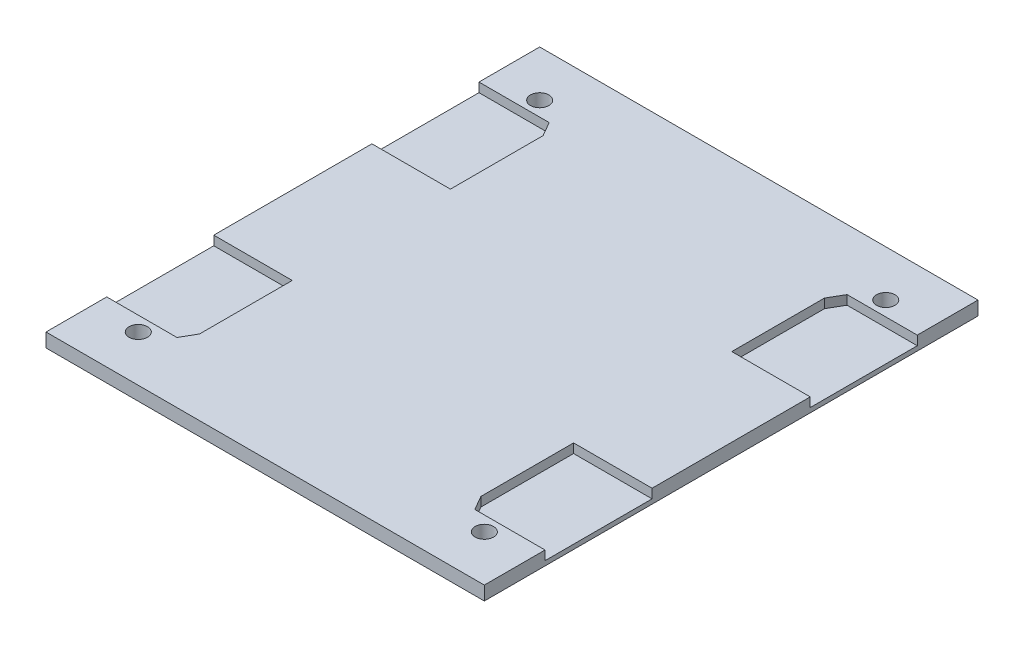
ISO-10303-21;
HEADER;
FILE_DESCRIPTION(('STEP AP214'),'2;1');
FILE_NAME('part.step','',(''),(''),'','','');
FILE_SCHEMA(('AUTOMOTIVE_DESIGN { 1 0 10303 214 1 1 1 1 }'));
ENDSEC;
DATA;
#1=APPLICATION_CONTEXT('core data for automotive mechanical design processes');
#2=APPLICATION_PROTOCOL_DEFINITION('international standard','automotive_design',2000,#1);
#3=PRODUCT_CONTEXT('',#1,'mechanical');
#4=PRODUCT('Part','Part','',(#3));
#5=PRODUCT_RELATED_PRODUCT_CATEGORY('part','',(#4));
#6=PRODUCT_DEFINITION_FORMATION('','',#4);
#7=PRODUCT_DEFINITION_CONTEXT('part definition',#1,'design');
#8=PRODUCT_DEFINITION('design','',#6,#7);
#9=PRODUCT_DEFINITION_SHAPE('','',#8);
#10=(LENGTH_UNIT() NAMED_UNIT(*) SI_UNIT(.MILLI.,.METRE.));
#11=(NAMED_UNIT(*) PLANE_ANGLE_UNIT() SI_UNIT($,.RADIAN.));
#12=(NAMED_UNIT(*) SI_UNIT($,.STERADIAN.) SOLID_ANGLE_UNIT());
#13=UNCERTAINTY_MEASURE_WITH_UNIT(LENGTH_MEASURE(1.E-05),#10,'distance_accuracy_value','');
#14=(GEOMETRIC_REPRESENTATION_CONTEXT(3) GLOBAL_UNCERTAINTY_ASSIGNED_CONTEXT((#13)) GLOBAL_UNIT_ASSIGNED_CONTEXT((#10,
#11,#12)) REPRESENTATION_CONTEXT('',''));
#15=CARTESIAN_POINT('',(0.,0.,0.));
#16=DIRECTION('',(0.,0.,1.));
#17=DIRECTION('',(1.,0.,0.));
#18=AXIS2_PLACEMENT_3D('',#15,#16,#17);
#19=CARTESIAN_POINT('',(47.5,3.,0.));
#20=DIRECTION('',(-1.,0.,0.));
#21=DIRECTION('',(0.,0.,1.));
#22=AXIS2_PLACEMENT_3D('',#19,#20,#21);
#23=PLANE('',#22);
#24=DIRECTION('',(0.,1.,0.));
#25=VECTOR('',#24,1.);
#26=CARTESIAN_POINT('',(47.5,1.,40.337063088162));
#27=LINE('',#26,#25);
#28=CARTESIAN_POINT('',(47.5,1.,40.337063088162));
#29=VERTEX_POINT('',#28);
#30=CARTESIAN_POINT('',(47.5,3.,40.337063088162));
#31=VERTEX_POINT('',#30);
#32=EDGE_CURVE('E248',#29,#31,#27,.T.);
#33=ORIENTED_EDGE('',*,*,#32,.T.);
#34=DIRECTION('',(0.,0.,-1.));
#35=VECTOR('',#34,1.);
#36=CARTESIAN_POINT('',(47.5,3.,0.));
#37=LINE('',#36,#35);
#38=CARTESIAN_POINT('',(47.5,3.,53.5));
#39=VERTEX_POINT('',#38);
#40=EDGE_CURVE('E347',#39,#31,#37,.T.);
#41=ORIENTED_EDGE('',*,*,#40,.F.);
#42=DIRECTION('',(0.,-1.,0.));
#43=VECTOR('',#42,1.);
#44=CARTESIAN_POINT('',(47.5,3.,53.5));
#45=LINE('',#44,#43);
#46=CARTESIAN_POINT('',(47.5,0.,53.5));
#47=VERTEX_POINT('',#46);
#48=EDGE_CURVE('E11',#39,#47,#45,.T.);
#49=ORIENTED_EDGE('',*,*,#48,.T.);
#50=DIRECTION('',(0.,0.,-1.));
#51=VECTOR('',#50,1.);
#52=CARTESIAN_POINT('',(47.5,0.,0.));
#53=LINE('',#52,#51);
#54=CARTESIAN_POINT('',(47.5,0.,-53.5));
#55=VERTEX_POINT('',#54);
#56=EDGE_CURVE('E374',#47,#55,#53,.T.);
#57=ORIENTED_EDGE('',*,*,#56,.T.);
#58=DIRECTION('',(0.,-1.,0.));
#59=VECTOR('',#58,1.);
#60=CARTESIAN_POINT('',(47.5,3.,-53.5));
#61=LINE('',#60,#59);
#62=CARTESIAN_POINT('',(47.5,3.,-53.5));
#63=VERTEX_POINT('',#62);
#64=EDGE_CURVE('E45',#63,#55,#61,.T.);
#65=ORIENTED_EDGE('',*,*,#64,.F.);
#66=CARTESIAN_POINT('',(47.5,3.,-40.337063088162));
#67=VERTEX_POINT('',#66);
#68=EDGE_CURVE('E225',#67,#63,#37,.T.);
#69=ORIENTED_EDGE('',*,*,#68,.F.);
#70=DIRECTION('',(0.,1.,0.));
#71=VECTOR('',#70,1.);
#72=CARTESIAN_POINT('',(47.5,1.,-40.337063088162));
#73=LINE('',#72,#71);
#74=CARTESIAN_POINT('',(47.5,1.,-40.337063088162));
#75=VERTEX_POINT('',#74);
#76=EDGE_CURVE('E204',#75,#67,#73,.T.);
#77=ORIENTED_EDGE('',*,*,#76,.F.);
#78=DIRECTION('',(0.,0.,-1.));
#79=VECTOR('',#78,1.);
#80=CARTESIAN_POINT('',(47.5,1.,0.));
#81=LINE('',#80,#79);
#82=CARTESIAN_POINT('',(47.5,1.,-17.1401594634259));
#83=VERTEX_POINT('',#82);
#84=EDGE_CURVE('E211',#83,#75,#81,.T.);
#85=ORIENTED_EDGE('',*,*,#84,.F.);
#86=DIRECTION('',(0.,1.,0.));
#87=VECTOR('',#86,1.);
#88=CARTESIAN_POINT('',(47.5,1.,-17.1401594634259));
#89=LINE('',#88,#87);
#90=CARTESIAN_POINT('',(47.5,3.,-17.1401594634259));
#91=VERTEX_POINT('',#90);
#92=EDGE_CURVE('E324',#83,#91,#89,.T.);
#93=ORIENTED_EDGE('',*,*,#92,.T.);
#94=CARTESIAN_POINT('',(47.5,3.,17.1401594634259));
#95=VERTEX_POINT('',#94);
#96=EDGE_CURVE('E351',#95,#91,#37,.T.);
#97=ORIENTED_EDGE('',*,*,#96,.F.);
#98=DIRECTION('',(0.,1.,0.));
#99=VECTOR('',#98,1.);
#100=CARTESIAN_POINT('',(47.5,1.,17.1401594634259));
#101=LINE('',#100,#99);
#102=CARTESIAN_POINT('',(47.5,1.,17.1401594634259));
#103=VERTEX_POINT('',#102);
#104=EDGE_CURVE('E269',#103,#95,#101,.T.);
#105=ORIENTED_EDGE('',*,*,#104,.F.);
#106=DIRECTION('',(0.,0.,-1.));
#107=VECTOR('',#106,1.);
#108=CARTESIAN_POINT('',(47.5,1.,0.));
#109=LINE('',#108,#107);
#110=EDGE_CURVE('E236',#29,#103,#109,.T.);
#111=ORIENTED_EDGE('',*,*,#110,.F.);
#112=EDGE_LOOP('',(#33,#41,#49,#57,#65,#69,#77,#85,#93,#97,#105,#111));
#113=FACE_BOUND('',#112,.T.);
#114=ADVANCED_FACE('F37',(#113),#23,.F.);
#115=CARTESIAN_POINT('',(-47.5,3.,0.));
#116=DIRECTION('',(-1.,0.,0.));
#117=DIRECTION('',(0.,0.,1.));
#118=AXIS2_PLACEMENT_3D('',#115,#116,#117);
#119=PLANE('',#118);
#120=DIRECTION('',(0.,0.,1.));
#121=VECTOR('',#120,1.);
#122=CARTESIAN_POINT('',(-47.5,1.,0.));
#123=LINE('',#122,#121);
#124=CARTESIAN_POINT('',(-47.5,1.,17.1401594634259));
#125=VERTEX_POINT('',#124);
#126=CARTESIAN_POINT('',(-47.5,1.,40.337063088162));
#127=VERTEX_POINT('',#126);
#128=EDGE_CURVE('E275',#125,#127,#123,.T.);
#129=ORIENTED_EDGE('',*,*,#128,.F.);
#130=DIRECTION('',(0.,1.,0.));
#131=VECTOR('',#130,1.);
#132=CARTESIAN_POINT('',(-47.5,1.,17.1401594634259));
#133=LINE('',#132,#131);
#134=CARTESIAN_POINT('',(-47.5,3.,17.1401594634259));
#135=VERTEX_POINT('',#134);
#136=EDGE_CURVE('E287',#125,#135,#133,.T.);
#137=ORIENTED_EDGE('',*,*,#136,.T.);
#138=DIRECTION('',(0.,0.,-1.));
#139=VECTOR('',#138,1.);
#140=CARTESIAN_POINT('',(-47.5,3.,0.));
#141=LINE('',#140,#139);
#142=CARTESIAN_POINT('',(-47.5,3.,-17.1401594634259));
#143=VERTEX_POINT('',#142);
#144=EDGE_CURVE('E359',#135,#143,#141,.T.);
#145=ORIENTED_EDGE('',*,*,#144,.T.);
#146=DIRECTION('',(0.,1.,0.));
#147=VECTOR('',#146,1.);
#148=CARTESIAN_POINT('',(-47.5,1.,-17.1401594634259));
#149=LINE('',#148,#147);
#150=CARTESIAN_POINT('',(-47.5,1.,-17.1401594634259));
#151=VERTEX_POINT('',#150);
#152=EDGE_CURVE('E52',#151,#143,#149,.T.);
#153=ORIENTED_EDGE('',*,*,#152,.F.);
#154=DIRECTION('',(0.,0.,1.));
#155=VECTOR('',#154,1.);
#156=CARTESIAN_POINT('',(-47.5,1.,0.));
#157=LINE('',#156,#155);
#158=CARTESIAN_POINT('',(-47.5,1.,-40.337063088162));
#159=VERTEX_POINT('',#158);
#160=EDGE_CURVE('E307',#159,#151,#157,.T.);
#161=ORIENTED_EDGE('',*,*,#160,.F.);
#162=DIRECTION('',(0.,1.,0.));
#163=VECTOR('',#162,1.);
#164=CARTESIAN_POINT('',(-47.5,1.,-40.337063088162));
#165=LINE('',#164,#163);
#166=CARTESIAN_POINT('',(-47.5,3.,-40.337063088162));
#167=VERTEX_POINT('',#166);
#168=EDGE_CURVE('E332',#159,#167,#165,.T.);
#169=ORIENTED_EDGE('',*,*,#168,.T.);
#170=CARTESIAN_POINT('',(-47.5,3.,-53.5));
#171=VERTEX_POINT('',#170);
#172=EDGE_CURVE('E354',#167,#171,#141,.T.);
#173=ORIENTED_EDGE('',*,*,#172,.T.);
#174=DIRECTION('',(0.,-1.,0.));
#175=VECTOR('',#174,1.);
#176=CARTESIAN_POINT('',(-47.5,3.,-53.5));
#177=LINE('',#176,#175);
#178=CARTESIAN_POINT('',(-47.5,0.,-53.5));
#179=VERTEX_POINT('',#178);
#180=EDGE_CURVE('E395',#171,#179,#177,.T.);
#181=ORIENTED_EDGE('',*,*,#180,.T.);
#182=DIRECTION('',(0.,0.,-1.));
#183=VECTOR('',#182,1.);
#184=CARTESIAN_POINT('',(-47.5,0.,0.));
#185=LINE('',#184,#183);
#186=CARTESIAN_POINT('',(-47.5,0.,53.5));
#187=VERTEX_POINT('',#186);
#188=EDGE_CURVE('E380',#187,#179,#185,.T.);
#189=ORIENTED_EDGE('',*,*,#188,.F.);
#190=DIRECTION('',(0.,-1.,0.));
#191=VECTOR('',#190,1.);
#192=CARTESIAN_POINT('',(-47.5,3.,53.5));
#193=LINE('',#192,#191);
#194=CARTESIAN_POINT('',(-47.5,3.,53.5));
#195=VERTEX_POINT('',#194);
#196=EDGE_CURVE('E371',#195,#187,#193,.T.);
#197=ORIENTED_EDGE('',*,*,#196,.F.);
#198=CARTESIAN_POINT('',(-47.5,3.,40.337063088162));
#199=VERTEX_POINT('',#198);
#200=EDGE_CURVE('E355',#195,#199,#141,.T.);
#201=ORIENTED_EDGE('',*,*,#200,.T.);
#202=DIRECTION('',(0.,1.,0.));
#203=VECTOR('',#202,1.);
#204=CARTESIAN_POINT('',(-47.5,1.,40.337063088162));
#205=LINE('',#204,#203);
#206=EDGE_CURVE('E60',#127,#199,#205,.T.);
#207=ORIENTED_EDGE('',*,*,#206,.F.);
#208=EDGE_LOOP('',(#129,#137,#145,#153,#161,#169,#173,#181,#189,#197,#201,#207));
#209=FACE_BOUND('',#208,.T.);
#210=ADVANCED_FACE('F409',(#209),#119,.T.);
#211=CARTESIAN_POINT('',(0.,3.,0.));
#212=DIRECTION('',(0.,1.,0.));
#213=DIRECTION('',(0.,0.,1.));
#214=AXIS2_PLACEMENT_3D('',#211,#212,#213);
#215=PLANE('',#214);
#216=CARTESIAN_POINT('',(-37.5,3.,-43.5));
#217=DIRECTION('',(0.,1.,0.));
#218=DIRECTION('',(0.,0.,1.));
#219=AXIS2_PLACEMENT_3D('',#216,#217,#218);
#220=CIRCLE('',#219,2.);
#221=CARTESIAN_POINT('',(-37.5,3.,-41.5));
#222=VERTEX_POINT('',#221);
#223=EDGE_CURVE('E358',#222,#222,#220,.T.);
#224=ORIENTED_EDGE('',*,*,#223,.F.);
#225=EDGE_LOOP('',(#224));
#226=FACE_BOUND('',#225,.T.);
#227=CARTESIAN_POINT('',(37.5,3.,-43.5));
#228=DIRECTION('',(0.,1.,0.));
#229=DIRECTION('',(0.,0.,1.));
#230=AXIS2_PLACEMENT_3D('',#227,#228,#229);
#231=CIRCLE('',#230,2.);
#232=CARTESIAN_POINT('',(37.5,3.,-41.5));
#233=VERTEX_POINT('',#232);
#234=EDGE_CURVE('E362',#233,#233,#231,.F.);
#235=ORIENTED_EDGE('',*,*,#234,.T.);
#236=EDGE_LOOP('',(#235));
#237=FACE_BOUND('',#236,.T.);
#238=CARTESIAN_POINT('',(37.5,3.,43.5));
#239=DIRECTION('',(0.,1.,0.));
#240=DIRECTION('',(0.,0.,1.));
#241=AXIS2_PLACEMENT_3D('',#238,#239,#240);
#242=CIRCLE('',#241,2.);
#243=CARTESIAN_POINT('',(37.5,3.,45.5));
#244=VERTEX_POINT('',#243);
#245=EDGE_CURVE('E365',#244,#244,#242,.T.);
#246=ORIENTED_EDGE('',*,*,#245,.F.);
#247=EDGE_LOOP('',(#246));
#248=FACE_BOUND('',#247,.T.);
#249=CARTESIAN_POINT('',(-37.5,3.,43.5));
#250=DIRECTION('',(0.,1.,0.));
#251=DIRECTION('',(0.,0.,1.));
#252=AXIS2_PLACEMENT_3D('',#249,#250,#251);
#253=CIRCLE('',#252,2.);
#254=CARTESIAN_POINT('',(-37.5,3.,45.5));
#255=VERTEX_POINT('',#254);
#256=EDGE_CURVE('E368',#255,#255,#253,.F.);
#257=ORIENTED_EDGE('',*,*,#256,.T.);
#258=EDGE_LOOP('',(#257));
#259=FACE_BOUND('',#258,.T.);
#260=ORIENTED_EDGE('',*,*,#144,.F.);
#261=DIRECTION('',(1.,0.,0.));
#262=VECTOR('',#261,1.);
#263=CARTESIAN_POINT('',(0.,3.,17.1401594634259));
#264=LINE('',#263,#262);
#265=CARTESIAN_POINT('',(-30.489963443197,3.,17.1401594634259));
#266=VERTEX_POINT('',#265);
#267=EDGE_CURVE('E288',#135,#266,#264,.T.);
#268=ORIENTED_EDGE('',*,*,#267,.T.);
#269=DIRECTION('',(0.,0.,1.));
#270=VECTOR('',#269,1.);
#271=CARTESIAN_POINT('',(-30.489963443197,3.,0.));
#272=LINE('',#271,#270);
#273=CARTESIAN_POINT('',(-30.489963443197,3.,37.232769094159));
#274=VERTEX_POINT('',#273);
#275=EDGE_CURVE('E276',#266,#274,#272,.T.);
#276=ORIENTED_EDGE('',*,*,#275,.T.);
#277=DIRECTION('',(0.500000000000003,0.,-0.866025403784437));
#278=VECTOR('',#277,1.);
#279=CARTESIAN_POINT('',(-6.74521063800666,3.,-3.8943491775939));
#280=LINE('',#279,#278);
#281=CARTESIAN_POINT('',(-32.2822284162783,3.,40.337063088162));
#282=VERTEX_POINT('',#281);
#283=EDGE_CURVE('E293',#282,#274,#280,.T.);
#284=ORIENTED_EDGE('',*,*,#283,.F.);
#285=DIRECTION('',(1.,0.,0.));
#286=VECTOR('',#285,1.);
#287=CARTESIAN_POINT('',(0.,3.,40.337063088162));
#288=LINE('',#287,#286);
#289=EDGE_CURVE('E291',#199,#282,#288,.T.);
#290=ORIENTED_EDGE('',*,*,#289,.F.);
#291=ORIENTED_EDGE('',*,*,#200,.F.);
#292=DIRECTION('',(1.,0.,0.));
#293=VECTOR('',#292,1.);
#294=CARTESIAN_POINT('',(0.,3.,53.5));
#295=LINE('',#294,#293);
#296=EDGE_CURVE('E343',#195,#39,#295,.T.);
#297=ORIENTED_EDGE('',*,*,#296,.T.);
#298=ORIENTED_EDGE('',*,*,#40,.T.);
#299=DIRECTION('',(-1.,0.,0.));
#300=VECTOR('',#299,1.);
#301=CARTESIAN_POINT('',(0.,3.,40.337063088162));
#302=LINE('',#301,#300);
#303=CARTESIAN_POINT('',(32.2822284162783,3.,40.337063088162));
#304=VERTEX_POINT('',#303);
#305=EDGE_CURVE('E249',#31,#304,#302,.T.);
#306=ORIENTED_EDGE('',*,*,#305,.T.);
#307=DIRECTION('',(-0.500000000000003,0.,-0.866025403784437));
#308=VECTOR('',#307,1.);
#309=CARTESIAN_POINT('',(6.74521063800668,3.,-3.8943491775939));
#310=LINE('',#309,#308);
#311=CARTESIAN_POINT('',(30.489963443197,3.,37.232769094159));
#312=VERTEX_POINT('',#311);
#313=EDGE_CURVE('E237',#304,#312,#310,.T.);
#314=ORIENTED_EDGE('',*,*,#313,.T.);
#315=DIRECTION('',(0.,0.,1.));
#316=VECTOR('',#315,1.);
#317=CARTESIAN_POINT('',(30.489963443197,3.,0.));
#318=LINE('',#317,#316);
#319=CARTESIAN_POINT('',(30.489963443197,3.,17.1401594634259));
#320=VERTEX_POINT('',#319);
#321=EDGE_CURVE('E256',#320,#312,#318,.T.);
#322=ORIENTED_EDGE('',*,*,#321,.F.);
#323=DIRECTION('',(-1.,0.,0.));
#324=VECTOR('',#323,1.);
#325=CARTESIAN_POINT('',(0.,3.,17.1401594634259));
#326=LINE('',#325,#324);
#327=EDGE_CURVE('E252',#95,#320,#326,.T.);
#328=ORIENTED_EDGE('',*,*,#327,.F.);
#329=ORIENTED_EDGE('',*,*,#96,.T.);
#330=DIRECTION('',(-1.,0.,0.));
#331=VECTOR('',#330,1.);
#332=CARTESIAN_POINT('',(0.,3.,-17.1401594634259));
#333=LINE('',#332,#331);
#334=CARTESIAN_POINT('',(30.489963443197,3.,-17.1401594634259));
#335=VERTEX_POINT('',#334);
#336=EDGE_CURVE('E220',#91,#335,#333,.T.);
#337=ORIENTED_EDGE('',*,*,#336,.T.);
#338=DIRECTION('',(0.,0.,-1.));
#339=VECTOR('',#338,1.);
#340=CARTESIAN_POINT('',(30.489963443197,3.,0.));
#341=LINE('',#340,#339);
#342=CARTESIAN_POINT('',(30.489963443197,3.,-37.232769094159));
#343=VERTEX_POINT('',#342);
#344=EDGE_CURVE('E436',#335,#343,#341,.T.);
#345=ORIENTED_EDGE('',*,*,#344,.T.);
#346=DIRECTION('',(-0.500000000000003,0.,0.866025403784437));
#347=VECTOR('',#346,1.);
#348=CARTESIAN_POINT('',(6.74521063800668,3.,3.8943491775939));
#349=LINE('',#348,#347);
#350=CARTESIAN_POINT('',(32.2822284162783,3.,-40.337063088162));
#351=VERTEX_POINT('',#350);
#352=EDGE_CURVE('E438',#351,#343,#349,.T.);
#353=ORIENTED_EDGE('',*,*,#352,.F.);
#354=DIRECTION('',(-1.,0.,0.));
#355=VECTOR('',#354,1.);
#356=CARTESIAN_POINT('',(0.,3.,-40.337063088162));
#357=LINE('',#356,#355);
#358=EDGE_CURVE('E264',#67,#351,#357,.T.);
#359=ORIENTED_EDGE('',*,*,#358,.F.);
#360=ORIENTED_EDGE('',*,*,#68,.T.);
#361=DIRECTION('',(1.,0.,0.));
#362=VECTOR('',#361,1.);
#363=CARTESIAN_POINT('',(0.,3.,-53.5));
#364=LINE('',#363,#362);
#365=EDGE_CURVE('E350',#171,#63,#364,.T.);
#366=ORIENTED_EDGE('',*,*,#365,.F.);
#367=ORIENTED_EDGE('',*,*,#172,.F.);
#368=DIRECTION('',(1.,0.,0.));
#369=VECTOR('',#368,1.);
#370=CARTESIAN_POINT('',(0.,3.,-40.337063088162));
#371=LINE('',#370,#369);
#372=CARTESIAN_POINT('',(-32.2822284162783,3.,-40.337063088162));
#373=VERTEX_POINT('',#372);
#374=EDGE_CURVE('E311',#167,#373,#371,.T.);
#375=ORIENTED_EDGE('',*,*,#374,.T.);
#376=DIRECTION('',(0.500000000000003,0.,0.866025403784437));
#377=VECTOR('',#376,1.);
#378=CARTESIAN_POINT('',(-6.74521063800666,3.,3.8943491775939));
#379=LINE('',#378,#377);
#380=CARTESIAN_POINT('',(-30.489963443197,3.,-37.232769094159));
#381=VERTEX_POINT('',#380);
#382=EDGE_CURVE('E327',#373,#381,#379,.T.);
#383=ORIENTED_EDGE('',*,*,#382,.T.);
#384=DIRECTION('',(0.,0.,-1.));
#385=VECTOR('',#384,1.);
#386=CARTESIAN_POINT('',(-30.489963443197,3.,0.));
#387=LINE('',#386,#385);
#388=CARTESIAN_POINT('',(-30.489963443197,3.,-17.1401594634259));
#389=VERTEX_POINT('',#388);
#390=EDGE_CURVE('E323',#389,#381,#387,.T.);
#391=ORIENTED_EDGE('',*,*,#390,.F.);
#392=DIRECTION('',(1.,0.,0.));
#393=VECTOR('',#392,1.);
#394=CARTESIAN_POINT('',(0.,3.,-17.1401594634259));
#395=LINE('',#394,#393);
#396=EDGE_CURVE('E321',#143,#389,#395,.T.);
#397=ORIENTED_EDGE('',*,*,#396,.F.);
#398=EDGE_LOOP('',(#260,#268,#276,#284,#290,#291,#297,#298,#306,#314,#322,#328,#329,#337,#345,
#353,#359,#360,#366,#367,#375,#383,#391,#397));
#399=FACE_BOUND('',#398,.T.);
#400=ADVANCED_FACE('F414',(#226,#237,#248,#259,#399),#215,.T.);
#401=CARTESIAN_POINT('',(0.,3.,53.5));
#402=DIRECTION('',(0.,0.,-1.));
#403=DIRECTION('',(-1.,0.,0.));
#404=AXIS2_PLACEMENT_3D('',#401,#402,#403);
#405=PLANE('',#404);
#406=DIRECTION('',(1.,0.,0.));
#407=VECTOR('',#406,1.);
#408=CARTESIAN_POINT('',(0.,0.,53.5));
#409=LINE('',#408,#407);
#410=EDGE_CURVE('E335',#187,#47,#409,.T.);
#411=ORIENTED_EDGE('',*,*,#410,.T.);
#412=ORIENTED_EDGE('',*,*,#48,.F.);
#413=ORIENTED_EDGE('',*,*,#296,.F.);
#414=ORIENTED_EDGE('',*,*,#196,.T.);
#415=EDGE_LOOP('',(#411,#412,#413,#414));
#416=FACE_BOUND('',#415,.T.);
#417=ADVANCED_FACE('F39',(#416),#405,.F.);
#418=CARTESIAN_POINT('',(0.,3.,-53.5));
#419=DIRECTION('',(0.,0.,-1.));
#420=DIRECTION('',(-1.,0.,0.));
#421=AXIS2_PLACEMENT_3D('',#418,#419,#420);
#422=PLANE('',#421);
#423=DIRECTION('',(1.,0.,0.));
#424=VECTOR('',#423,1.);
#425=CARTESIAN_POINT('',(0.,0.,-53.5));
#426=LINE('',#425,#424);
#427=EDGE_CURVE('E377',#179,#55,#426,.T.);
#428=ORIENTED_EDGE('',*,*,#427,.F.);
#429=ORIENTED_EDGE('',*,*,#180,.F.);
#430=ORIENTED_EDGE('',*,*,#365,.T.);
#431=ORIENTED_EDGE('',*,*,#64,.T.);
#432=EDGE_LOOP('',(#428,#429,#430,#431));
#433=FACE_BOUND('',#432,.T.);
#434=ADVANCED_FACE('F398',(#433),#422,.T.);
#435=CARTESIAN_POINT('',(37.5,3.,43.5));
#436=DIRECTION('',(0.,-1.,0.));
#437=DIRECTION('',(0.,0.,-1.));
#438=AXIS2_PLACEMENT_3D('',#435,#436,#437);
#439=CYLINDRICAL_SURFACE('',#438,2.);
#440=ORIENTED_EDGE('',*,*,#245,.T.);
#441=EDGE_LOOP('',(#440));
#442=FACE_BOUND('',#441,.T.);
#443=CARTESIAN_POINT('',(37.5,0.,43.5));
#444=DIRECTION('',(0.,1.,0.));
#445=DIRECTION('',(0.,0.,1.));
#446=AXIS2_PLACEMENT_3D('',#443,#444,#445);
#447=CIRCLE('',#446,2.);
#448=CARTESIAN_POINT('',(37.5,0.,45.5));
#449=VERTEX_POINT('',#448);
#450=EDGE_CURVE('E389',#449,#449,#447,.T.);
#451=ORIENTED_EDGE('',*,*,#450,.F.);
#452=EDGE_LOOP('',(#451));
#453=FACE_BOUND('',#452,.T.);
#454=ADVANCED_FACE('F461',(#442,#453),#439,.F.);
#455=CARTESIAN_POINT('',(37.5,3.,-43.5));
#456=DIRECTION('',(0.,-1.,0.));
#457=DIRECTION('',(0.,0.,-1.));
#458=AXIS2_PLACEMENT_3D('',#455,#456,#457);
#459=CYLINDRICAL_SURFACE('',#458,2.);
#460=ORIENTED_EDGE('',*,*,#234,.F.);
#461=EDGE_LOOP('',(#460));
#462=FACE_BOUND('',#461,.T.);
#463=CARTESIAN_POINT('',(37.5,0.,-43.5));
#464=DIRECTION('',(0.,1.,0.));
#465=DIRECTION('',(0.,0.,1.));
#466=AXIS2_PLACEMENT_3D('',#463,#464,#465);
#467=CIRCLE('',#466,2.);
#468=CARTESIAN_POINT('',(37.5,0.,-41.5));
#469=VERTEX_POINT('',#468);
#470=EDGE_CURVE('E386',#469,#469,#467,.F.);
#471=ORIENTED_EDGE('',*,*,#470,.T.);
#472=EDGE_LOOP('',(#471));
#473=FACE_BOUND('',#472,.T.);
#474=ADVANCED_FACE('F467',(#462,#473),#459,.F.);
#475=CARTESIAN_POINT('',(-37.5,3.,-43.5));
#476=DIRECTION('',(0.,-1.,0.));
#477=DIRECTION('',(0.,0.,-1.));
#478=AXIS2_PLACEMENT_3D('',#475,#476,#477);
#479=CYLINDRICAL_SURFACE('',#478,2.);
#480=ORIENTED_EDGE('',*,*,#223,.T.);
#481=EDGE_LOOP('',(#480));
#482=FACE_BOUND('',#481,.T.);
#483=CARTESIAN_POINT('',(-37.5,0.,-43.5));
#484=DIRECTION('',(0.,1.,0.));
#485=DIRECTION('',(0.,0.,1.));
#486=AXIS2_PLACEMENT_3D('',#483,#484,#485);
#487=CIRCLE('',#486,2.);
#488=CARTESIAN_POINT('',(-37.5,0.,-41.5));
#489=VERTEX_POINT('',#488);
#490=EDGE_CURVE('E383',#489,#489,#487,.T.);
#491=ORIENTED_EDGE('',*,*,#490,.F.);
#492=EDGE_LOOP('',(#491));
#493=FACE_BOUND('',#492,.T.);
#494=ADVANCED_FACE('F463',(#482,#493),#479,.F.);
#495=CARTESIAN_POINT('',(-37.5,3.,43.5));
#496=DIRECTION('',(0.,-1.,0.));
#497=DIRECTION('',(0.,0.,-1.));
#498=AXIS2_PLACEMENT_3D('',#495,#496,#497);
#499=CYLINDRICAL_SURFACE('',#498,2.);
#500=ORIENTED_EDGE('',*,*,#256,.F.);
#501=EDGE_LOOP('',(#500));
#502=FACE_BOUND('',#501,.T.);
#503=CARTESIAN_POINT('',(-37.5,0.,43.5));
#504=DIRECTION('',(0.,1.,0.));
#505=DIRECTION('',(0.,0.,1.));
#506=AXIS2_PLACEMENT_3D('',#503,#504,#505);
#507=CIRCLE('',#506,2.);
#508=CARTESIAN_POINT('',(-37.5,0.,45.5));
#509=VERTEX_POINT('',#508);
#510=EDGE_CURVE('E346',#509,#509,#507,.F.);
#511=ORIENTED_EDGE('',*,*,#510,.T.);
#512=EDGE_LOOP('',(#511));
#513=FACE_BOUND('',#512,.T.);
#514=ADVANCED_FACE('F466',(#502,#513),#499,.F.);
#515=CARTESIAN_POINT('',(0.,0.,0.));
#516=DIRECTION('',(0.,1.,0.));
#517=DIRECTION('',(0.,0.,1.));
#518=AXIS2_PLACEMENT_3D('',#515,#516,#517);
#519=PLANE('',#518);
#520=ORIENTED_EDGE('',*,*,#410,.F.);
#521=ORIENTED_EDGE('',*,*,#188,.T.);
#522=ORIENTED_EDGE('',*,*,#427,.T.);
#523=ORIENTED_EDGE('',*,*,#56,.F.);
#524=EDGE_LOOP('',(#520,#521,#522,#523));
#525=FACE_BOUND('',#524,.T.);
#526=ORIENTED_EDGE('',*,*,#490,.T.);
#527=EDGE_LOOP('',(#526));
#528=FACE_BOUND('',#527,.T.);
#529=ORIENTED_EDGE('',*,*,#470,.F.);
#530=EDGE_LOOP('',(#529));
#531=FACE_BOUND('',#530,.T.);
#532=ORIENTED_EDGE('',*,*,#450,.T.);
#533=EDGE_LOOP('',(#532));
#534=FACE_BOUND('',#533,.T.);
#535=ORIENTED_EDGE('',*,*,#510,.F.);
#536=EDGE_LOOP('',(#535));
#537=FACE_BOUND('',#536,.T.);
#538=ADVANCED_FACE('F404',(#525,#528,#531,#534,#537),#519,.F.);
#539=CARTESIAN_POINT('',(0.,1.,-40.337063088162));
#540=DIRECTION('',(0.,0.,1.));
#541=DIRECTION('',(1.,0.,0.));
#542=AXIS2_PLACEMENT_3D('',#539,#540,#541);
#543=PLANE('',#542);
#544=ORIENTED_EDGE('',*,*,#374,.F.);
#545=ORIENTED_EDGE('',*,*,#168,.F.);
#546=DIRECTION('',(1.,0.,0.));
#547=VECTOR('',#546,1.);
#548=CARTESIAN_POINT('',(0.,1.,-40.337063088162));
#549=LINE('',#548,#547);
#550=CARTESIAN_POINT('',(-32.2822284162783,1.,-40.337063088162));
#551=VERTEX_POINT('',#550);
#552=EDGE_CURVE('E319',#159,#551,#549,.T.);
#553=ORIENTED_EDGE('',*,*,#552,.T.);
#554=DIRECTION('',(0.,1.,0.));
#555=VECTOR('',#554,1.);
#556=CARTESIAN_POINT('',(-32.2822284162783,1.,-40.337063088162));
#557=LINE('',#556,#555);
#558=EDGE_CURVE('E336',#551,#373,#557,.T.);
#559=ORIENTED_EDGE('',*,*,#558,.T.);
#560=EDGE_LOOP('',(#544,#545,#553,#559));
#561=FACE_BOUND('',#560,.T.);
#562=ADVANCED_FACE('F480',(#561),#543,.T.);
#563=CARTESIAN_POINT('',(-6.74521063800666,1.,3.8943491775939));
#564=DIRECTION('',(-0.866025403784437,0.,0.500000000000003));
#565=DIRECTION('',(0.500000000000003,0.,0.866025403784437));
#566=AXIS2_PLACEMENT_3D('',#563,#564,#565);
#567=PLANE('',#566);
#568=ORIENTED_EDGE('',*,*,#382,.F.);
#569=ORIENTED_EDGE('',*,*,#558,.F.);
#570=DIRECTION('',(0.500000000000003,0.,0.866025403784437));
#571=VECTOR('',#570,1.);
#572=CARTESIAN_POINT('',(-6.74521063800666,1.,3.8943491775939));
#573=LINE('',#572,#571);
#574=CARTESIAN_POINT('',(-30.489963443197,1.,-37.232769094159));
#575=VERTEX_POINT('',#574);
#576=EDGE_CURVE('E317',#551,#575,#573,.T.);
#577=ORIENTED_EDGE('',*,*,#576,.T.);
#578=DIRECTION('',(0.,1.,0.));
#579=VECTOR('',#578,1.);
#580=CARTESIAN_POINT('',(-30.489963443197,1.,-37.232769094159));
#581=LINE('',#580,#579);
#582=EDGE_CURVE('E338',#575,#381,#581,.T.);
#583=ORIENTED_EDGE('',*,*,#582,.T.);
#584=EDGE_LOOP('',(#568,#569,#577,#583));
#585=FACE_BOUND('',#584,.T.);
#586=ADVANCED_FACE('F491',(#585),#567,.T.);
#587=CARTESIAN_POINT('',(-30.489963443197,1.,0.));
#588=DIRECTION('',(1.,0.,0.));
#589=DIRECTION('',(0.,0.,-1.));
#590=AXIS2_PLACEMENT_3D('',#587,#588,#589);
#591=PLANE('',#590);
#592=ORIENTED_EDGE('',*,*,#390,.T.);
#593=ORIENTED_EDGE('',*,*,#582,.F.);
#594=DIRECTION('',(0.,0.,-1.));
#595=VECTOR('',#594,1.);
#596=CARTESIAN_POINT('',(-30.489963443197,1.,0.));
#597=LINE('',#596,#595);
#598=CARTESIAN_POINT('',(-30.489963443197,1.,-17.1401594634259));
#599=VERTEX_POINT('',#598);
#600=EDGE_CURVE('E314',#599,#575,#597,.T.);
#601=ORIENTED_EDGE('',*,*,#600,.F.);
#602=DIRECTION('',(0.,1.,0.));
#603=VECTOR('',#602,1.);
#604=CARTESIAN_POINT('',(-30.489963443197,1.,-17.1401594634259));
#605=LINE('',#604,#603);
#606=EDGE_CURVE('E340',#599,#389,#605,.T.);
#607=ORIENTED_EDGE('',*,*,#606,.T.);
#608=EDGE_LOOP('',(#592,#593,#601,#607));
#609=FACE_BOUND('',#608,.T.);
#610=ADVANCED_FACE('F488',(#609),#591,.F.);
#611=CARTESIAN_POINT('',(0.,1.,-17.1401594634259));
#612=DIRECTION('',(0.,0.,1.));
#613=DIRECTION('',(1.,0.,0.));
#614=AXIS2_PLACEMENT_3D('',#611,#612,#613);
#615=PLANE('',#614);
#616=ORIENTED_EDGE('',*,*,#396,.T.);
#617=ORIENTED_EDGE('',*,*,#606,.F.);
#618=DIRECTION('',(1.,0.,0.));
#619=VECTOR('',#618,1.);
#620=CARTESIAN_POINT('',(0.,1.,-17.1401594634259));
#621=LINE('',#620,#619);
#622=EDGE_CURVE('E310',#151,#599,#621,.T.);
#623=ORIENTED_EDGE('',*,*,#622,.F.);
#624=ORIENTED_EDGE('',*,*,#152,.T.);
#625=EDGE_LOOP('',(#616,#617,#623,#624));
#626=FACE_BOUND('',#625,.T.);
#627=ADVANCED_FACE('F484',(#626),#615,.F.);
#628=CARTESIAN_POINT('',(0.,1.,0.));
#629=DIRECTION('',(0.,1.,0.));
#630=DIRECTION('',(0.,0.,1.));
#631=AXIS2_PLACEMENT_3D('',#628,#629,#630);
#632=PLANE('',#631);
#633=ORIENTED_EDGE('',*,*,#160,.T.);
#634=ORIENTED_EDGE('',*,*,#622,.T.);
#635=ORIENTED_EDGE('',*,*,#600,.T.);
#636=ORIENTED_EDGE('',*,*,#576,.F.);
#637=ORIENTED_EDGE('',*,*,#552,.F.);
#638=EDGE_LOOP('',(#633,#634,#635,#636,#637));
#639=FACE_BOUND('',#638,.T.);
#640=ADVANCED_FACE('F487',(#639),#632,.T.);
#641=CARTESIAN_POINT('',(0.,1.,-17.1401594634259));
#642=DIRECTION('',(0.,0.,-1.));
#643=DIRECTION('',(-1.,0.,0.));
#644=AXIS2_PLACEMENT_3D('',#641,#642,#643);
#645=PLANE('',#644);
#646=ORIENTED_EDGE('',*,*,#336,.F.);
#647=ORIENTED_EDGE('',*,*,#92,.F.);
#648=DIRECTION('',(-1.,0.,0.));
#649=VECTOR('',#648,1.);
#650=CARTESIAN_POINT('',(0.,1.,-17.1401594634259));
#651=LINE('',#650,#649);
#652=CARTESIAN_POINT('',(30.489963443197,1.,-17.1401594634259));
#653=VERTEX_POINT('',#652);
#654=EDGE_CURVE('E217',#83,#653,#651,.T.);
#655=ORIENTED_EDGE('',*,*,#654,.T.);
#656=DIRECTION('',(0.,1.,0.));
#657=VECTOR('',#656,1.);
#658=CARTESIAN_POINT('',(30.489963443197,1.,-17.1401594634259));
#659=LINE('',#658,#657);
#660=EDGE_CURVE('E425',#653,#335,#659,.T.);
#661=ORIENTED_EDGE('',*,*,#660,.T.);
#662=EDGE_LOOP('',(#646,#647,#655,#661));
#663=FACE_BOUND('',#662,.T.);
#664=ADVANCED_FACE('F451',(#663),#645,.T.);
#665=CARTESIAN_POINT('',(30.489963443197,1.,0.));
#666=DIRECTION('',(1.,0.,0.));
#667=DIRECTION('',(0.,0.,-1.));
#668=AXIS2_PLACEMENT_3D('',#665,#666,#667);
#669=PLANE('',#668);
#670=ORIENTED_EDGE('',*,*,#344,.F.);
#671=ORIENTED_EDGE('',*,*,#660,.F.);
#672=DIRECTION('',(0.,0.,-1.));
#673=VECTOR('',#672,1.);
#674=CARTESIAN_POINT('',(30.489963443197,1.,0.));
#675=LINE('',#674,#673);
#676=CARTESIAN_POINT('',(30.489963443197,1.,-37.232769094159));
#677=VERTEX_POINT('',#676);
#678=EDGE_CURVE('E229',#653,#677,#675,.T.);
#679=ORIENTED_EDGE('',*,*,#678,.T.);
#680=DIRECTION('',(0.,1.,0.));
#681=VECTOR('',#680,1.);
#682=CARTESIAN_POINT('',(30.489963443197,1.,-37.232769094159));
#683=LINE('',#682,#681);
#684=EDGE_CURVE('E227',#677,#343,#683,.T.);
#685=ORIENTED_EDGE('',*,*,#684,.T.);
#686=EDGE_LOOP('',(#670,#671,#679,#685));
#687=FACE_BOUND('',#686,.T.);
#688=ADVANCED_FACE('F434',(#687),#669,.T.);
#689=CARTESIAN_POINT('',(6.74521063800668,1.,3.8943491775939));
#690=DIRECTION('',(-0.866025403784437,0.,-0.500000000000003));
#691=DIRECTION('',(-0.500000000000003,0.,0.866025403784437));
#692=AXIS2_PLACEMENT_3D('',#689,#690,#691);
#693=PLANE('',#692);
#694=ORIENTED_EDGE('',*,*,#352,.T.);
#695=ORIENTED_EDGE('',*,*,#684,.F.);
#696=DIRECTION('',(-0.500000000000003,0.,0.866025403784437));
#697=VECTOR('',#696,1.);
#698=CARTESIAN_POINT('',(6.74521063800668,1.,3.8943491775939));
#699=LINE('',#698,#697);
#700=CARTESIAN_POINT('',(32.2822284162783,1.,-40.337063088162));
#701=VERTEX_POINT('',#700);
#702=EDGE_CURVE('E210',#701,#677,#699,.T.);
#703=ORIENTED_EDGE('',*,*,#702,.F.);
#704=DIRECTION('',(0.,1.,0.));
#705=VECTOR('',#704,1.);
#706=CARTESIAN_POINT('',(32.2822284162783,1.,-40.337063088162));
#707=LINE('',#706,#705);
#708=EDGE_CURVE('E206',#701,#351,#707,.T.);
#709=ORIENTED_EDGE('',*,*,#708,.T.);
#710=EDGE_LOOP('',(#694,#695,#703,#709));
#711=FACE_BOUND('',#710,.T.);
#712=ADVANCED_FACE('F439',(#711),#693,.F.);
#713=CARTESIAN_POINT('',(0.,1.,-40.337063088162));
#714=DIRECTION('',(0.,0.,-1.));
#715=DIRECTION('',(-1.,0.,0.));
#716=AXIS2_PLACEMENT_3D('',#713,#714,#715);
#717=PLANE('',#716);
#718=ORIENTED_EDGE('',*,*,#358,.T.);
#719=ORIENTED_EDGE('',*,*,#708,.F.);
#720=DIRECTION('',(-1.,0.,0.));
#721=VECTOR('',#720,1.);
#722=CARTESIAN_POINT('',(0.,1.,-40.337063088162));
#723=LINE('',#722,#721);
#724=EDGE_CURVE('E199',#75,#701,#723,.T.);
#725=ORIENTED_EDGE('',*,*,#724,.F.);
#726=ORIENTED_EDGE('',*,*,#76,.T.);
#727=EDGE_LOOP('',(#718,#719,#725,#726));
#728=FACE_BOUND('',#727,.T.);
#729=ADVANCED_FACE('F202',(#728),#717,.F.);
#730=CARTESIAN_POINT('',(0.,1.,0.));
#731=DIRECTION('',(0.,1.,0.));
#732=DIRECTION('',(0.,0.,1.));
#733=AXIS2_PLACEMENT_3D('',#730,#731,#732);
#734=PLANE('',#733);
#735=ORIENTED_EDGE('',*,*,#84,.T.);
#736=ORIENTED_EDGE('',*,*,#724,.T.);
#737=ORIENTED_EDGE('',*,*,#702,.T.);
#738=ORIENTED_EDGE('',*,*,#678,.F.);
#739=ORIENTED_EDGE('',*,*,#654,.F.);
#740=EDGE_LOOP('',(#735,#736,#737,#738,#739));
#741=FACE_BOUND('',#740,.T.);
#742=ADVANCED_FACE('F215',(#741),#734,.T.);
#743=CARTESIAN_POINT('',(0.,1.,40.337063088162));
#744=DIRECTION('',(0.,0.,-1.));
#745=DIRECTION('',(-1.,0.,0.));
#746=AXIS2_PLACEMENT_3D('',#743,#744,#745);
#747=PLANE('',#746);
#748=ORIENTED_EDGE('',*,*,#305,.F.);
#749=ORIENTED_EDGE('',*,*,#32,.F.);
#750=DIRECTION('',(-1.,0.,0.));
#751=VECTOR('',#750,1.);
#752=CARTESIAN_POINT('',(0.,1.,40.337063088162));
#753=LINE('',#752,#751);
#754=CARTESIAN_POINT('',(32.2822284162783,1.,40.337063088162));
#755=VERTEX_POINT('',#754);
#756=EDGE_CURVE('E233',#29,#755,#753,.T.);
#757=ORIENTED_EDGE('',*,*,#756,.T.);
#758=DIRECTION('',(0.,1.,0.));
#759=VECTOR('',#758,1.);
#760=CARTESIAN_POINT('',(32.2822284162783,1.,40.337063088162));
#761=LINE('',#760,#759);
#762=EDGE_CURVE('E261',#755,#304,#761,.T.);
#763=ORIENTED_EDGE('',*,*,#762,.T.);
#764=EDGE_LOOP('',(#748,#749,#757,#763));
#765=FACE_BOUND('',#764,.T.);
#766=ADVANCED_FACE('F522',(#765),#747,.T.);
#767=CARTESIAN_POINT('',(6.74521063800668,1.,-3.8943491775939));
#768=DIRECTION('',(0.866025403784437,0.,-0.500000000000003));
#769=DIRECTION('',(-0.500000000000003,0.,-0.866025403784437));
#770=AXIS2_PLACEMENT_3D('',#767,#768,#769);
#771=PLANE('',#770);
#772=ORIENTED_EDGE('',*,*,#313,.F.);
#773=ORIENTED_EDGE('',*,*,#762,.F.);
#774=DIRECTION('',(-0.500000000000003,0.,-0.866025403784437));
#775=VECTOR('',#774,1.);
#776=CARTESIAN_POINT('',(6.74521063800668,1.,-3.8943491775939));
#777=LINE('',#776,#775);
#778=CARTESIAN_POINT('',(30.489963443197,1.,37.232769094159));
#779=VERTEX_POINT('',#778);
#780=EDGE_CURVE('E246',#755,#779,#777,.T.);
#781=ORIENTED_EDGE('',*,*,#780,.T.);
#782=DIRECTION('',(0.,1.,0.));
#783=VECTOR('',#782,1.);
#784=CARTESIAN_POINT('',(30.489963443197,1.,37.232769094159));
#785=LINE('',#784,#783);
#786=EDGE_CURVE('E265',#779,#312,#785,.T.);
#787=ORIENTED_EDGE('',*,*,#786,.T.);
#788=EDGE_LOOP('',(#772,#773,#781,#787));
#789=FACE_BOUND('',#788,.T.);
#790=ADVANCED_FACE('F525',(#789),#771,.T.);
#791=CARTESIAN_POINT('',(30.489963443197,1.,0.));
#792=DIRECTION('',(-1.,0.,0.));
#793=DIRECTION('',(0.,0.,1.));
#794=AXIS2_PLACEMENT_3D('',#791,#792,#793);
#795=PLANE('',#794);
#796=ORIENTED_EDGE('',*,*,#321,.T.);
#797=ORIENTED_EDGE('',*,*,#786,.F.);
#798=DIRECTION('',(0.,0.,1.));
#799=VECTOR('',#798,1.);
#800=CARTESIAN_POINT('',(30.489963443197,1.,0.));
#801=LINE('',#800,#799);
#802=CARTESIAN_POINT('',(30.489963443197,1.,17.1401594634259));
#803=VERTEX_POINT('',#802);
#804=EDGE_CURVE('E243',#803,#779,#801,.T.);
#805=ORIENTED_EDGE('',*,*,#804,.F.);
#806=DIRECTION('',(0.,1.,0.));
#807=VECTOR('',#806,1.);
#808=CARTESIAN_POINT('',(30.489963443197,1.,17.1401594634259));
#809=LINE('',#808,#807);
#810=EDGE_CURVE('E267',#803,#320,#809,.T.);
#811=ORIENTED_EDGE('',*,*,#810,.T.);
#812=EDGE_LOOP('',(#796,#797,#805,#811));
#813=FACE_BOUND('',#812,.T.);
#814=ADVANCED_FACE('F530',(#813),#795,.F.);
#815=CARTESIAN_POINT('',(0.,1.,17.1401594634259));
#816=DIRECTION('',(0.,0.,-1.));
#817=DIRECTION('',(-1.,0.,0.));
#818=AXIS2_PLACEMENT_3D('',#815,#816,#817);
#819=PLANE('',#818);
#820=ORIENTED_EDGE('',*,*,#327,.T.);
#821=ORIENTED_EDGE('',*,*,#810,.F.);
#822=DIRECTION('',(-1.,0.,0.));
#823=VECTOR('',#822,1.);
#824=CARTESIAN_POINT('',(0.,1.,17.1401594634259));
#825=LINE('',#824,#823);
#826=EDGE_CURVE('E240',#103,#803,#825,.T.);
#827=ORIENTED_EDGE('',*,*,#826,.F.);
#828=ORIENTED_EDGE('',*,*,#104,.T.);
#829=EDGE_LOOP('',(#820,#821,#827,#828));
#830=FACE_BOUND('',#829,.T.);
#831=ADVANCED_FACE('F527',(#830),#819,.F.);
#832=CARTESIAN_POINT('',(0.,1.,0.));
#833=DIRECTION('',(0.,1.,0.));
#834=DIRECTION('',(0.,0.,1.));
#835=AXIS2_PLACEMENT_3D('',#832,#833,#834);
#836=PLANE('',#835);
#837=ORIENTED_EDGE('',*,*,#756,.F.);
#838=ORIENTED_EDGE('',*,*,#110,.T.);
#839=ORIENTED_EDGE('',*,*,#826,.T.);
#840=ORIENTED_EDGE('',*,*,#804,.T.);
#841=ORIENTED_EDGE('',*,*,#780,.F.);
#842=EDGE_LOOP('',(#837,#838,#839,#840,#841));
#843=FACE_BOUND('',#842,.T.);
#844=ADVANCED_FACE('F506',(#843),#836,.T.);
#845=CARTESIAN_POINT('',(0.,1.,17.1401594634259));
#846=DIRECTION('',(0.,0.,1.));
#847=DIRECTION('',(1.,0.,0.));
#848=AXIS2_PLACEMENT_3D('',#845,#846,#847);
#849=PLANE('',#848);
#850=ORIENTED_EDGE('',*,*,#267,.F.);
#851=ORIENTED_EDGE('',*,*,#136,.F.);
#852=DIRECTION('',(1.,0.,0.));
#853=VECTOR('',#852,1.);
#854=CARTESIAN_POINT('',(0.,1.,17.1401594634259));
#855=LINE('',#854,#853);
#856=CARTESIAN_POINT('',(-30.489963443197,1.,17.1401594634259));
#857=VERTEX_POINT('',#856);
#858=EDGE_CURVE('E272',#125,#857,#855,.T.);
#859=ORIENTED_EDGE('',*,*,#858,.T.);
#860=DIRECTION('',(0.,1.,0.));
#861=VECTOR('',#860,1.);
#862=CARTESIAN_POINT('',(-30.489963443197,1.,17.1401594634259));
#863=LINE('',#862,#861);
#864=EDGE_CURVE('E253',#857,#266,#863,.T.);
#865=ORIENTED_EDGE('',*,*,#864,.T.);
#866=EDGE_LOOP('',(#850,#851,#859,#865));
#867=FACE_BOUND('',#866,.T.);
#868=ADVANCED_FACE('F502',(#867),#849,.T.);
#869=CARTESIAN_POINT('',(-30.489963443197,1.,0.));
#870=DIRECTION('',(-1.,0.,0.));
#871=DIRECTION('',(0.,0.,1.));
#872=AXIS2_PLACEMENT_3D('',#869,#870,#871);
#873=PLANE('',#872);
#874=ORIENTED_EDGE('',*,*,#275,.F.);
#875=ORIENTED_EDGE('',*,*,#864,.F.);
#876=DIRECTION('',(0.,0.,1.));
#877=VECTOR('',#876,1.);
#878=CARTESIAN_POINT('',(-30.489963443197,1.,0.));
#879=LINE('',#878,#877);
#880=CARTESIAN_POINT('',(-30.489963443197,1.,37.232769094159));
#881=VERTEX_POINT('',#880);
#882=EDGE_CURVE('E285',#857,#881,#879,.T.);
#883=ORIENTED_EDGE('',*,*,#882,.T.);
#884=DIRECTION('',(0.,1.,0.));
#885=VECTOR('',#884,1.);
#886=CARTESIAN_POINT('',(-30.489963443197,1.,37.232769094159));
#887=LINE('',#886,#885);
#888=EDGE_CURVE('E300',#881,#274,#887,.T.);
#889=ORIENTED_EDGE('',*,*,#888,.T.);
#890=EDGE_LOOP('',(#874,#875,#883,#889));
#891=FACE_BOUND('',#890,.T.);
#892=ADVANCED_FACE('F505',(#891),#873,.T.);
#893=CARTESIAN_POINT('',(-6.74521063800666,1.,-3.8943491775939));
#894=DIRECTION('',(0.866025403784437,0.,0.500000000000003));
#895=DIRECTION('',(0.500000000000003,0.,-0.866025403784437));
#896=AXIS2_PLACEMENT_3D('',#893,#894,#895);
#897=PLANE('',#896);
#898=ORIENTED_EDGE('',*,*,#283,.T.);
#899=ORIENTED_EDGE('',*,*,#888,.F.);
#900=DIRECTION('',(0.500000000000003,0.,-0.866025403784437));
#901=VECTOR('',#900,1.);
#902=CARTESIAN_POINT('',(-6.74521063800666,1.,-3.8943491775939));
#903=LINE('',#902,#901);
#904=CARTESIAN_POINT('',(-32.2822284162783,1.,40.337063088162));
#905=VERTEX_POINT('',#904);
#906=EDGE_CURVE('E282',#905,#881,#903,.T.);
#907=ORIENTED_EDGE('',*,*,#906,.F.);
#908=DIRECTION('',(0.,1.,0.));
#909=VECTOR('',#908,1.);
#910=CARTESIAN_POINT('',(-32.2822284162783,1.,40.337063088162));
#911=LINE('',#910,#909);
#912=EDGE_CURVE('E302',#905,#282,#911,.T.);
#913=ORIENTED_EDGE('',*,*,#912,.T.);
#914=EDGE_LOOP('',(#898,#899,#907,#913));
#915=FACE_BOUND('',#914,.T.);
#916=ADVANCED_FACE('F512',(#915),#897,.F.);
#917=CARTESIAN_POINT('',(0.,1.,40.337063088162));
#918=DIRECTION('',(0.,0.,1.));
#919=DIRECTION('',(1.,0.,0.));
#920=AXIS2_PLACEMENT_3D('',#917,#918,#919);
#921=PLANE('',#920);
#922=ORIENTED_EDGE('',*,*,#289,.T.);
#923=ORIENTED_EDGE('',*,*,#912,.F.);
#924=DIRECTION('',(1.,0.,0.));
#925=VECTOR('',#924,1.);
#926=CARTESIAN_POINT('',(0.,1.,40.337063088162));
#927=LINE('',#926,#925);
#928=EDGE_CURVE('E279',#127,#905,#927,.T.);
#929=ORIENTED_EDGE('',*,*,#928,.F.);
#930=ORIENTED_EDGE('',*,*,#206,.T.);
#931=EDGE_LOOP('',(#922,#923,#929,#930));
#932=FACE_BOUND('',#931,.T.);
#933=ADVANCED_FACE('F508',(#932),#921,.F.);
#934=CARTESIAN_POINT('',(0.,1.,0.));
#935=DIRECTION('',(0.,1.,0.));
#936=DIRECTION('',(0.,0.,1.));
#937=AXIS2_PLACEMENT_3D('',#934,#935,#936);
#938=PLANE('',#937);
#939=ORIENTED_EDGE('',*,*,#858,.F.);
#940=ORIENTED_EDGE('',*,*,#128,.T.);
#941=ORIENTED_EDGE('',*,*,#928,.T.);
#942=ORIENTED_EDGE('',*,*,#906,.T.);
#943=ORIENTED_EDGE('',*,*,#882,.F.);
#944=EDGE_LOOP('',(#939,#940,#941,#942,#943));
#945=FACE_BOUND('',#944,.T.);
#946=ADVANCED_FACE('F511',(#945),#938,.T.);
#947=CLOSED_SHELL('',(#114,#210,#400,#417,#434,#454,#474,#494,#514,#538,#562,#586,#610,#627,
#640,#664,#688,#712,#729,#742,#766,#790,#814,#831,#844,#868,#892,#916,#933,#946));
#948=MANIFOLD_SOLID_BREP('B2',#947);
#949=ADVANCED_BREP_SHAPE_REPRESENTATION('',(#18,#948),#14);
#950=SHAPE_DEFINITION_REPRESENTATION(#9,#949);
ENDSEC;
END-ISO-10303-21;
